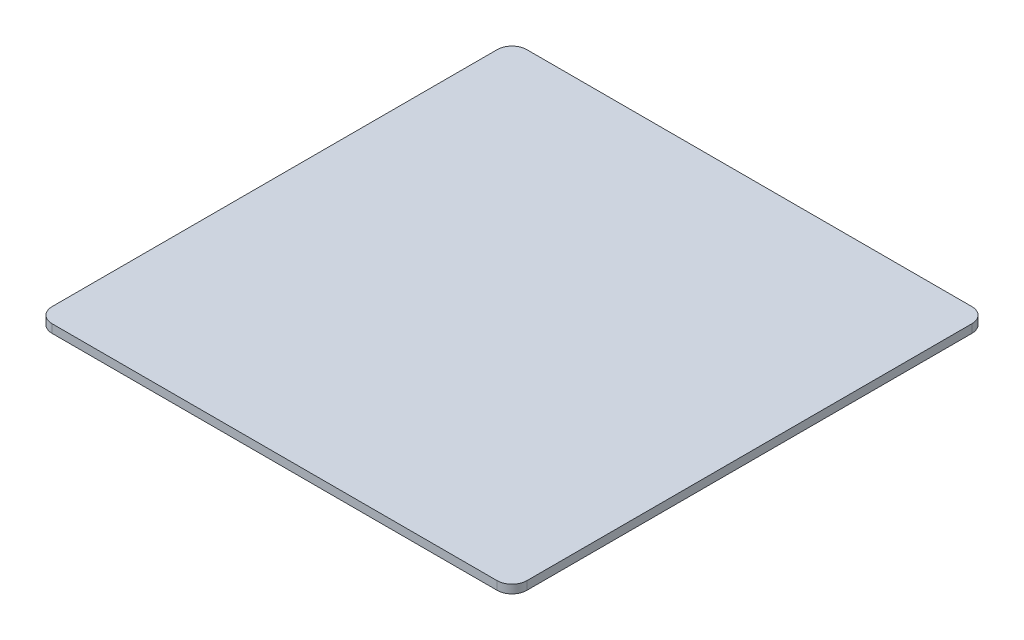
ISO-10303-21;
HEADER;
FILE_DESCRIPTION(('STEP AP214'),'2;1');
FILE_NAME('part.step','',(''),(''),'','','');
FILE_SCHEMA(('AUTOMOTIVE_DESIGN { 1 0 10303 214 1 1 1 1 }'));
ENDSEC;
DATA;
#1=APPLICATION_CONTEXT('core data for automotive mechanical design processes');
#2=APPLICATION_PROTOCOL_DEFINITION('international standard','automotive_design',2000,#1);
#3=PRODUCT_CONTEXT('',#1,'mechanical');
#4=PRODUCT('Part','Part','',(#3));
#5=PRODUCT_RELATED_PRODUCT_CATEGORY('part','',(#4));
#6=PRODUCT_DEFINITION_FORMATION('','',#4);
#7=PRODUCT_DEFINITION_CONTEXT('part definition',#1,'design');
#8=PRODUCT_DEFINITION('design','',#6,#7);
#9=PRODUCT_DEFINITION_SHAPE('','',#8);
#10=(LENGTH_UNIT() NAMED_UNIT(*) SI_UNIT(.MILLI.,.METRE.));
#11=(NAMED_UNIT(*) PLANE_ANGLE_UNIT() SI_UNIT($,.RADIAN.));
#12=(NAMED_UNIT(*) SI_UNIT($,.STERADIAN.) SOLID_ANGLE_UNIT());
#13=UNCERTAINTY_MEASURE_WITH_UNIT(LENGTH_MEASURE(1.E-05),#10,'distance_accuracy_value','');
#14=(GEOMETRIC_REPRESENTATION_CONTEXT(3) GLOBAL_UNCERTAINTY_ASSIGNED_CONTEXT((#13)) GLOBAL_UNIT_ASSIGNED_CONTEXT((#10,
#11,#12)) REPRESENTATION_CONTEXT('',''));
#15=CARTESIAN_POINT('',(0.,0.,0.));
#16=DIRECTION('',(0.,0.,1.));
#17=DIRECTION('',(1.,0.,0.));
#18=AXIS2_PLACEMENT_3D('',#15,#16,#17);
#19=CARTESIAN_POINT('',(-48.,1.7,48.));
#20=DIRECTION('',(1.,0.,0.));
#21=DIRECTION('',(0.,0.,-1.));
#22=AXIS2_PLACEMENT_3D('',#19,#20,#21);
#23=PLANE('',#22);
#24=DIRECTION('',(0.,0.,1.));
#25=VECTOR('',#24,1.);
#26=CARTESIAN_POINT('',(-48.,1.7,48.));
#27=LINE('',#26,#25);
#28=CARTESIAN_POINT('',(-48.,1.7,-45.));
#29=VERTEX_POINT('',#28);
#30=CARTESIAN_POINT('',(-48.,1.7,45.));
#31=VERTEX_POINT('',#30);
#32=EDGE_CURVE('E127',#29,#31,#27,.T.);
#33=ORIENTED_EDGE('',*,*,#32,.F.);
#34=DIRECTION('',(0.,-1.,0.));
#35=VECTOR('',#34,1.);
#36=CARTESIAN_POINT('',(-48.,1.7,-45.));
#37=LINE('',#36,#35);
#38=CARTESIAN_POINT('',(-48.,0.,-45.));
#39=VERTEX_POINT('',#38);
#40=EDGE_CURVE('E11',#29,#39,#37,.T.);
#41=ORIENTED_EDGE('',*,*,#40,.T.);
#42=DIRECTION('',(0.,0.,1.));
#43=VECTOR('',#42,1.);
#44=CARTESIAN_POINT('',(-48.,0.,48.));
#45=LINE('',#44,#43);
#46=CARTESIAN_POINT('',(-48.,0.,45.));
#47=VERTEX_POINT('',#46);
#48=EDGE_CURVE('E129',#39,#47,#45,.T.);
#49=ORIENTED_EDGE('',*,*,#48,.T.);
#50=DIRECTION('',(0.,-1.,0.));
#51=VECTOR('',#50,1.);
#52=CARTESIAN_POINT('',(-48.,1.7,45.));
#53=LINE('',#52,#51);
#54=EDGE_CURVE('E40',#47,#31,#53,.F.);
#55=ORIENTED_EDGE('',*,*,#54,.T.);
#56=EDGE_LOOP('',(#33,#41,#49,#55));
#57=FACE_BOUND('',#56,.T.);
#58=ADVANCED_FACE('F32',(#57),#23,.F.);
#59=CARTESIAN_POINT('',(48.,1.7,48.));
#60=DIRECTION('',(0.,0.,-1.));
#61=DIRECTION('',(-1.,0.,0.));
#62=AXIS2_PLACEMENT_3D('',#59,#60,#61);
#63=PLANE('',#62);
#64=DIRECTION('',(1.,0.,0.));
#65=VECTOR('',#64,1.);
#66=CARTESIAN_POINT('',(48.,0.,48.));
#67=LINE('',#66,#65);
#68=CARTESIAN_POINT('',(-45.,0.,48.));
#69=VERTEX_POINT('',#68);
#70=CARTESIAN_POINT('',(45.,0.,48.));
#71=VERTEX_POINT('',#70);
#72=EDGE_CURVE('E125',#69,#71,#67,.T.);
#73=ORIENTED_EDGE('',*,*,#72,.T.);
#74=DIRECTION('',(0.,-1.,0.));
#75=VECTOR('',#74,1.);
#76=CARTESIAN_POINT('',(45.,1.7,48.));
#77=LINE('',#76,#75);
#78=CARTESIAN_POINT('',(45.,1.7,48.));
#79=VERTEX_POINT('',#78);
#80=EDGE_CURVE('E104',#71,#79,#77,.F.);
#81=ORIENTED_EDGE('',*,*,#80,.T.);
#82=DIRECTION('',(1.,0.,0.));
#83=VECTOR('',#82,1.);
#84=CARTESIAN_POINT('',(48.,1.7,48.));
#85=LINE('',#84,#83);
#86=CARTESIAN_POINT('',(-45.,1.7,48.));
#87=VERTEX_POINT('',#86);
#88=EDGE_CURVE('E165',#87,#79,#85,.T.);
#89=ORIENTED_EDGE('',*,*,#88,.F.);
#90=DIRECTION('',(0.,-1.,0.));
#91=VECTOR('',#90,1.);
#92=CARTESIAN_POINT('',(-45.,1.7,48.));
#93=LINE('',#92,#91);
#94=EDGE_CURVE('E109',#87,#69,#93,.T.);
#95=ORIENTED_EDGE('',*,*,#94,.T.);
#96=EDGE_LOOP('',(#73,#81,#89,#95));
#97=FACE_BOUND('',#96,.T.);
#98=ADVANCED_FACE('F169',(#97),#63,.F.);
#99=CARTESIAN_POINT('',(48.,1.7,48.));
#100=DIRECTION('',(-1.,0.,0.));
#101=DIRECTION('',(0.,0.,1.));
#102=AXIS2_PLACEMENT_3D('',#99,#100,#101);
#103=PLANE('',#102);
#104=DIRECTION('',(0.,0.,-1.));
#105=VECTOR('',#104,1.);
#106=CARTESIAN_POINT('',(48.,1.7,48.));
#107=LINE('',#106,#105);
#108=CARTESIAN_POINT('',(48.,1.7,45.));
#109=VERTEX_POINT('',#108);
#110=CARTESIAN_POINT('',(48.,1.7,-45.));
#111=VERTEX_POINT('',#110);
#112=EDGE_CURVE('E118',#109,#111,#107,.T.);
#113=ORIENTED_EDGE('',*,*,#112,.F.);
#114=DIRECTION('',(0.,-1.,0.));
#115=VECTOR('',#114,1.);
#116=CARTESIAN_POINT('',(48.,1.7,45.));
#117=LINE('',#116,#115);
#118=CARTESIAN_POINT('',(48.,0.,45.));
#119=VERTEX_POINT('',#118);
#120=EDGE_CURVE('E103',#109,#119,#117,.T.);
#121=ORIENTED_EDGE('',*,*,#120,.T.);
#122=DIRECTION('',(0.,0.,-1.));
#123=VECTOR('',#122,1.);
#124=CARTESIAN_POINT('',(48.,0.,48.));
#125=LINE('',#124,#123);
#126=CARTESIAN_POINT('',(48.,0.,-45.));
#127=VERTEX_POINT('',#126);
#128=EDGE_CURVE('E116',#119,#127,#125,.T.);
#129=ORIENTED_EDGE('',*,*,#128,.T.);
#130=DIRECTION('',(0.,-1.,0.));
#131=VECTOR('',#130,1.);
#132=CARTESIAN_POINT('',(48.,1.7,-45.));
#133=LINE('',#132,#131);
#134=EDGE_CURVE('E120',#127,#111,#133,.F.);
#135=ORIENTED_EDGE('',*,*,#134,.T.);
#136=EDGE_LOOP('',(#113,#121,#129,#135));
#137=FACE_BOUND('',#136,.T.);
#138=ADVANCED_FACE('F115',(#137),#103,.F.);
#139=CARTESIAN_POINT('',(48.,1.7,-48.));
#140=DIRECTION('',(0.,0.,1.));
#141=DIRECTION('',(1.,0.,0.));
#142=AXIS2_PLACEMENT_3D('',#139,#140,#141);
#143=PLANE('',#142);
#144=DIRECTION('',(-1.,0.,0.));
#145=VECTOR('',#144,1.);
#146=CARTESIAN_POINT('',(48.,1.7,-48.));
#147=LINE('',#146,#145);
#148=CARTESIAN_POINT('',(45.,1.7,-48.));
#149=VERTEX_POINT('',#148);
#150=CARTESIAN_POINT('',(-45.,1.7,-48.));
#151=VERTEX_POINT('',#150);
#152=EDGE_CURVE('E133',#149,#151,#147,.T.);
#153=ORIENTED_EDGE('',*,*,#152,.F.);
#154=DIRECTION('',(0.,-1.,0.));
#155=VECTOR('',#154,1.);
#156=CARTESIAN_POINT('',(45.,1.7,-48.));
#157=LINE('',#156,#155);
#158=CARTESIAN_POINT('',(45.,0.,-48.));
#159=VERTEX_POINT('',#158);
#160=EDGE_CURVE('E150',#149,#159,#157,.T.);
#161=ORIENTED_EDGE('',*,*,#160,.T.);
#162=DIRECTION('',(-1.,0.,0.));
#163=VECTOR('',#162,1.);
#164=CARTESIAN_POINT('',(48.,0.,-48.));
#165=LINE('',#164,#163);
#166=CARTESIAN_POINT('',(-45.,0.,-48.));
#167=VERTEX_POINT('',#166);
#168=EDGE_CURVE('E124',#159,#167,#165,.T.);
#169=ORIENTED_EDGE('',*,*,#168,.T.);
#170=DIRECTION('',(0.,-1.,0.));
#171=VECTOR('',#170,1.);
#172=CARTESIAN_POINT('',(-45.,1.7,-48.));
#173=LINE('',#172,#171);
#174=EDGE_CURVE('E47',#167,#151,#173,.F.);
#175=ORIENTED_EDGE('',*,*,#174,.T.);
#176=EDGE_LOOP('',(#153,#161,#169,#175));
#177=FACE_BOUND('',#176,.T.);
#178=ADVANCED_FACE('F176',(#177),#143,.F.);
#179=CARTESIAN_POINT('',(0.,1.7,0.));
#180=DIRECTION('',(0.,1.,0.));
#181=DIRECTION('',(0.,0.,1.));
#182=AXIS2_PLACEMENT_3D('',#179,#180,#181);
#183=PLANE('',#182);
#184=ORIENTED_EDGE('',*,*,#88,.T.);
#185=CARTESIAN_POINT('',(45.,1.7,45.));
#186=DIRECTION('',(0.,1.,0.));
#187=DIRECTION('',(0.,0.,1.));
#188=AXIS2_PLACEMENT_3D('',#185,#186,#187);
#189=CIRCLE('',#188,3.);
#190=EDGE_CURVE('E147',#79,#109,#189,.T.);
#191=ORIENTED_EDGE('',*,*,#190,.T.);
#192=ORIENTED_EDGE('',*,*,#112,.T.);
#193=CARTESIAN_POINT('',(45.,1.7,-45.));
#194=DIRECTION('',(0.,1.,0.));
#195=DIRECTION('',(0.,0.,1.));
#196=AXIS2_PLACEMENT_3D('',#193,#194,#195);
#197=CIRCLE('',#196,3.);
#198=EDGE_CURVE('E54',#111,#149,#197,.T.);
#199=ORIENTED_EDGE('',*,*,#198,.T.);
#200=ORIENTED_EDGE('',*,*,#152,.T.);
#201=CARTESIAN_POINT('',(-45.,1.7,-45.));
#202=DIRECTION('',(0.,1.,0.));
#203=DIRECTION('',(0.,0.,1.));
#204=AXIS2_PLACEMENT_3D('',#201,#202,#203);
#205=CIRCLE('',#204,3.);
#206=EDGE_CURVE('E144',#151,#29,#205,.T.);
#207=ORIENTED_EDGE('',*,*,#206,.T.);
#208=ORIENTED_EDGE('',*,*,#32,.T.);
#209=CARTESIAN_POINT('',(-45.,1.7,45.));
#210=DIRECTION('',(0.,1.,0.));
#211=DIRECTION('',(0.,0.,1.));
#212=AXIS2_PLACEMENT_3D('',#209,#210,#211);
#213=CIRCLE('',#212,3.);
#214=EDGE_CURVE('E142',#31,#87,#213,.T.);
#215=ORIENTED_EDGE('',*,*,#214,.T.);
#216=EDGE_LOOP('',(#184,#191,#192,#199,#200,#207,#208,#215));
#217=FACE_BOUND('',#216,.T.);
#218=ADVANCED_FACE('F162',(#217),#183,.T.);
#219=CARTESIAN_POINT('',(0.,0.,0.));
#220=DIRECTION('',(0.,1.,0.));
#221=DIRECTION('',(0.,0.,1.));
#222=AXIS2_PLACEMENT_3D('',#219,#220,#221);
#223=PLANE('',#222);
#224=ORIENTED_EDGE('',*,*,#128,.F.);
#225=CARTESIAN_POINT('',(45.,0.,45.));
#226=DIRECTION('',(0.,1.,0.));
#227=DIRECTION('',(0.,0.,1.));
#228=AXIS2_PLACEMENT_3D('',#225,#226,#227);
#229=CIRCLE('',#228,3.);
#230=EDGE_CURVE('E99',#119,#71,#229,.F.);
#231=ORIENTED_EDGE('',*,*,#230,.T.);
#232=ORIENTED_EDGE('',*,*,#72,.F.);
#233=CARTESIAN_POINT('',(-45.,0.,45.));
#234=DIRECTION('',(0.,1.,0.));
#235=DIRECTION('',(0.,0.,1.));
#236=AXIS2_PLACEMENT_3D('',#233,#234,#235);
#237=CIRCLE('',#236,3.);
#238=EDGE_CURVE('E119',#69,#47,#237,.F.);
#239=ORIENTED_EDGE('',*,*,#238,.T.);
#240=ORIENTED_EDGE('',*,*,#48,.F.);
#241=CARTESIAN_POINT('',(-45.,0.,-45.));
#242=DIRECTION('',(0.,1.,0.));
#243=DIRECTION('',(0.,0.,1.));
#244=AXIS2_PLACEMENT_3D('',#241,#242,#243);
#245=CIRCLE('',#244,3.);
#246=EDGE_CURVE('E136',#39,#167,#245,.F.);
#247=ORIENTED_EDGE('',*,*,#246,.T.);
#248=ORIENTED_EDGE('',*,*,#168,.F.);
#249=CARTESIAN_POINT('',(45.,0.,-45.));
#250=DIRECTION('',(0.,1.,0.));
#251=DIRECTION('',(0.,0.,1.));
#252=AXIS2_PLACEMENT_3D('',#249,#250,#251);
#253=CIRCLE('',#252,3.);
#254=EDGE_CURVE('E110',#159,#127,#253,.F.);
#255=ORIENTED_EDGE('',*,*,#254,.T.);
#256=EDGE_LOOP('',(#224,#231,#232,#239,#240,#247,#248,#255));
#257=FACE_BOUND('',#256,.T.);
#258=ADVANCED_FACE('F122',(#257),#223,.F.);
#259=CARTESIAN_POINT('',(45.,1.7,45.));
#260=DIRECTION('',(0.,-1.,0.));
#261=DIRECTION('',(0.,0.,-1.));
#262=AXIS2_PLACEMENT_3D('',#259,#260,#261);
#263=CYLINDRICAL_SURFACE('',#262,3.);
#264=ORIENTED_EDGE('',*,*,#190,.F.);
#265=ORIENTED_EDGE('',*,*,#80,.F.);
#266=ORIENTED_EDGE('',*,*,#230,.F.);
#267=ORIENTED_EDGE('',*,*,#120,.F.);
#268=EDGE_LOOP('',(#264,#265,#266,#267));
#269=FACE_BOUND('',#268,.T.);
#270=ADVANCED_FACE('F102',(#269),#263,.T.);
#271=CARTESIAN_POINT('',(45.,1.7,-45.));
#272=DIRECTION('',(0.,-1.,0.));
#273=DIRECTION('',(0.,0.,-1.));
#274=AXIS2_PLACEMENT_3D('',#271,#272,#273);
#275=CYLINDRICAL_SURFACE('',#274,3.);
#276=ORIENTED_EDGE('',*,*,#198,.F.);
#277=ORIENTED_EDGE('',*,*,#134,.F.);
#278=ORIENTED_EDGE('',*,*,#254,.F.);
#279=ORIENTED_EDGE('',*,*,#160,.F.);
#280=EDGE_LOOP('',(#276,#277,#278,#279));
#281=FACE_BOUND('',#280,.T.);
#282=ADVANCED_FACE('F175',(#281),#275,.T.);
#283=CARTESIAN_POINT('',(-45.,1.7,-45.));
#284=DIRECTION('',(0.,-1.,0.));
#285=DIRECTION('',(0.,0.,-1.));
#286=AXIS2_PLACEMENT_3D('',#283,#284,#285);
#287=CYLINDRICAL_SURFACE('',#286,3.);
#288=ORIENTED_EDGE('',*,*,#206,.F.);
#289=ORIENTED_EDGE('',*,*,#174,.F.);
#290=ORIENTED_EDGE('',*,*,#246,.F.);
#291=ORIENTED_EDGE('',*,*,#40,.F.);
#292=EDGE_LOOP('',(#288,#289,#290,#291));
#293=FACE_BOUND('',#292,.T.);
#294=ADVANCED_FACE('F178',(#293),#287,.T.);
#295=CARTESIAN_POINT('',(-45.,1.7,45.));
#296=DIRECTION('',(0.,-1.,0.));
#297=DIRECTION('',(0.,0.,-1.));
#298=AXIS2_PLACEMENT_3D('',#295,#296,#297);
#299=CYLINDRICAL_SURFACE('',#298,3.);
#300=ORIENTED_EDGE('',*,*,#214,.F.);
#301=ORIENTED_EDGE('',*,*,#54,.F.);
#302=ORIENTED_EDGE('',*,*,#238,.F.);
#303=ORIENTED_EDGE('',*,*,#94,.F.);
#304=EDGE_LOOP('',(#300,#301,#302,#303));
#305=FACE_BOUND('',#304,.T.);
#306=ADVANCED_FACE('F34',(#305),#299,.T.);
#307=CLOSED_SHELL('',(#58,#98,#138,#178,#218,#258,#270,#282,#294,#306));
#308=MANIFOLD_SOLID_BREP('B2',#307);
#309=ADVANCED_BREP_SHAPE_REPRESENTATION('',(#18,#308),#14);
#310=SHAPE_DEFINITION_REPRESENTATION(#9,#309);
ENDSEC;
END-ISO-10303-21;
